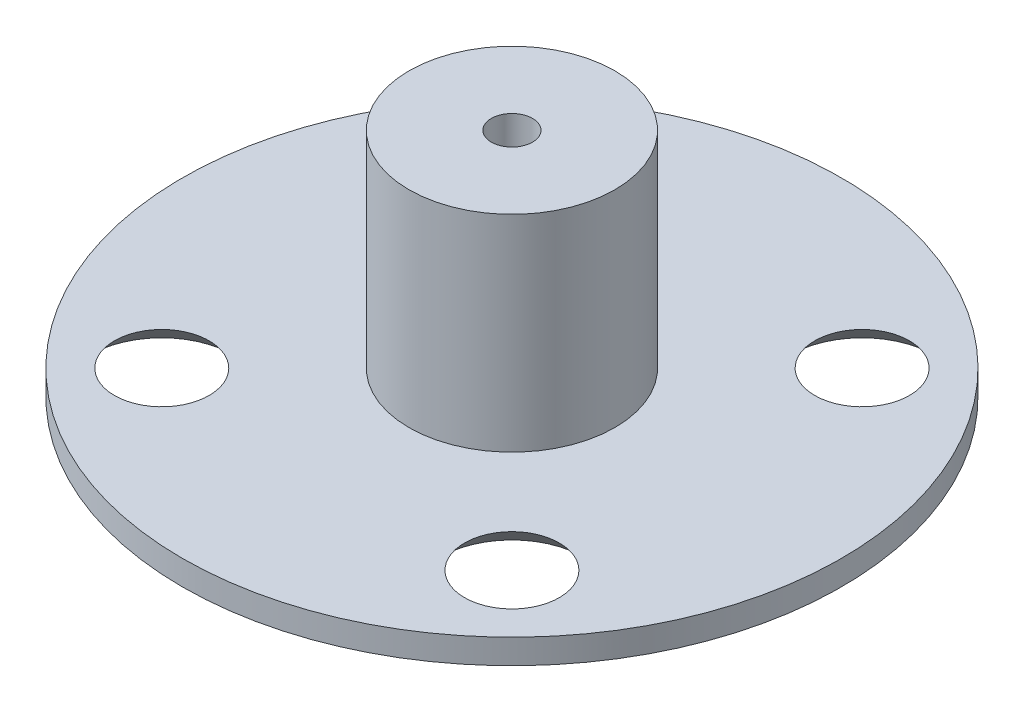
ISO-10303-21;
HEADER;
FILE_DESCRIPTION(('STEP AP214'),'2;1');
FILE_NAME('part.step','',(''),(''),'','','');
FILE_SCHEMA(('AUTOMOTIVE_DESIGN { 1 0 10303 214 1 1 1 1 }'));
ENDSEC;
DATA;
#1=APPLICATION_CONTEXT('core data for automotive mechanical design processes');
#2=APPLICATION_PROTOCOL_DEFINITION('international standard','automotive_design',2000,#1);
#3=PRODUCT_CONTEXT('',#1,'mechanical');
#4=PRODUCT('Part','Part','',(#3));
#5=PRODUCT_RELATED_PRODUCT_CATEGORY('part','',(#4));
#6=PRODUCT_DEFINITION_FORMATION('','',#4);
#7=PRODUCT_DEFINITION_CONTEXT('part definition',#1,'design');
#8=PRODUCT_DEFINITION('design','',#6,#7);
#9=PRODUCT_DEFINITION_SHAPE('','',#8);
#10=(LENGTH_UNIT() NAMED_UNIT(*) SI_UNIT(.MILLI.,.METRE.));
#11=(NAMED_UNIT(*) PLANE_ANGLE_UNIT() SI_UNIT($,.RADIAN.));
#12=(NAMED_UNIT(*) SI_UNIT($,.STERADIAN.) SOLID_ANGLE_UNIT());
#13=UNCERTAINTY_MEASURE_WITH_UNIT(LENGTH_MEASURE(1.E-05),#10,'distance_accuracy_value','');
#14=(GEOMETRIC_REPRESENTATION_CONTEXT(3) GLOBAL_UNCERTAINTY_ASSIGNED_CONTEXT((#13)) GLOBAL_UNIT_ASSIGNED_CONTEXT((#10,
#11,#12)) REPRESENTATION_CONTEXT('',''));
#15=CARTESIAN_POINT('',(0.,0.,0.));
#16=DIRECTION('',(0.,0.,1.));
#17=DIRECTION('',(1.,0.,0.));
#18=AXIS2_PLACEMENT_3D('',#15,#16,#17);
#19=CARTESIAN_POINT('',(0.,0.6,0.));
#20=DIRECTION('',(0.,1.,0.));
#21=DIRECTION('',(0.,0.,1.));
#22=AXIS2_PLACEMENT_3D('',#19,#20,#21);
#23=PLANE('',#22);
#24=CARTESIAN_POINT('',(4.25,0.6,4.25));
#25=DIRECTION('',(0.,1.,0.));
#26=DIRECTION('',(0.,0.,1.));
#27=AXIS2_PLACEMENT_3D('',#24,#25,#26);
#28=CIRCLE('',#27,1.15000000000001);
#29=CARTESIAN_POINT('',(4.25,0.6,5.40000000000001));
#30=VERTEX_POINT('',#29);
#31=EDGE_CURVE('E10',#30,#30,#28,.F.);
#32=ORIENTED_EDGE('',*,*,#31,.T.);
#33=EDGE_LOOP('',(#32));
#34=FACE_BOUND('',#33,.T.);
#35=CARTESIAN_POINT('',(-4.25,0.6,4.25));
#36=DIRECTION('',(0.,1.,0.));
#37=DIRECTION('',(0.,0.,1.));
#38=AXIS2_PLACEMENT_3D('',#35,#36,#37);
#39=CIRCLE('',#38,1.15000000000001);
#40=CARTESIAN_POINT('',(-4.25,0.6,5.40000000000001));
#41=VERTEX_POINT('',#40);
#42=EDGE_CURVE('E43',#41,#41,#39,.F.);
#43=ORIENTED_EDGE('',*,*,#42,.T.);
#44=EDGE_LOOP('',(#43));
#45=FACE_BOUND('',#44,.T.);
#46=CARTESIAN_POINT('',(-4.25,0.6,-4.25));
#47=DIRECTION('',(0.,1.,0.));
#48=DIRECTION('',(0.,0.,1.));
#49=AXIS2_PLACEMENT_3D('',#46,#47,#48);
#50=CIRCLE('',#49,1.15000000000001);
#51=CARTESIAN_POINT('',(-4.25,0.6,-3.09999999999999));
#52=VERTEX_POINT('',#51);
#53=EDGE_CURVE('E47',#52,#52,#50,.F.);
#54=ORIENTED_EDGE('',*,*,#53,.T.);
#55=EDGE_LOOP('',(#54));
#56=FACE_BOUND('',#55,.T.);
#57=CARTESIAN_POINT('',(4.25,0.6,-4.25));
#58=DIRECTION('',(0.,1.,0.));
#59=DIRECTION('',(0.,0.,1.));
#60=AXIS2_PLACEMENT_3D('',#57,#58,#59);
#61=CIRCLE('',#60,1.15000000000001);
#62=CARTESIAN_POINT('',(4.25,0.6,-3.09999999999999));
#63=VERTEX_POINT('',#62);
#64=EDGE_CURVE('E51',#63,#63,#61,.F.);
#65=ORIENTED_EDGE('',*,*,#64,.T.);
#66=EDGE_LOOP('',(#65));
#67=FACE_BOUND('',#66,.T.);
#68=CARTESIAN_POINT('',(0.,0.6,0.));
#69=DIRECTION('',(0.,1.,0.));
#70=DIRECTION('',(0.,0.,1.));
#71=AXIS2_PLACEMENT_3D('',#68,#69,#70);
#72=CIRCLE('',#71,2.5);
#73=CARTESIAN_POINT('',(0.,0.6,2.5));
#74=VERTEX_POINT('',#73);
#75=EDGE_CURVE('E75',#74,#74,#72,.T.);
#76=ORIENTED_EDGE('',*,*,#75,.F.);
#77=EDGE_LOOP('',(#76));
#78=FACE_BOUND('',#77,.T.);
#79=CARTESIAN_POINT('',(0.,0.6,0.));
#80=DIRECTION('',(0.,1.,0.));
#81=DIRECTION('',(0.,0.,1.));
#82=AXIS2_PLACEMENT_3D('',#79,#80,#81);
#83=CIRCLE('',#82,8.);
#84=CARTESIAN_POINT('',(0.,0.6,8.));
#85=VERTEX_POINT('',#84);
#86=EDGE_CURVE('E68',#85,#85,#83,.T.);
#87=ORIENTED_EDGE('',*,*,#86,.T.);
#88=EDGE_LOOP('',(#87));
#89=FACE_BOUND('',#88,.T.);
#90=ADVANCED_FACE('F35',(#34,#45,#56,#67,#78,#89),#23,.T.);
#91=CARTESIAN_POINT('',(0.,0.,0.));
#92=DIRECTION('',(0.,1.,0.));
#93=DIRECTION('',(0.,0.,1.));
#94=AXIS2_PLACEMENT_3D('',#91,#92,#93);
#95=PLANE('',#94);
#96=CARTESIAN_POINT('',(4.25,0.,4.25));
#97=DIRECTION('',(0.,1.,0.));
#98=DIRECTION('',(0.,0.,1.));
#99=AXIS2_PLACEMENT_3D('',#96,#97,#98);
#100=CIRCLE('',#99,1.75000000000001);
#101=CARTESIAN_POINT('',(4.25,0.,6.00000000000001));
#102=VERTEX_POINT('',#101);
#103=EDGE_CURVE('E56',#102,#102,#100,.T.);
#104=ORIENTED_EDGE('',*,*,#103,.T.);
#105=EDGE_LOOP('',(#104));
#106=FACE_BOUND('',#105,.T.);
#107=CARTESIAN_POINT('',(-4.25,0.,4.25));
#108=DIRECTION('',(0.,1.,0.));
#109=DIRECTION('',(0.,0.,1.));
#110=AXIS2_PLACEMENT_3D('',#107,#108,#109);
#111=CIRCLE('',#110,1.75000000000001);
#112=CARTESIAN_POINT('',(-4.25,0.,6.00000000000001));
#113=VERTEX_POINT('',#112);
#114=EDGE_CURVE('E59',#113,#113,#111,.T.);
#115=ORIENTED_EDGE('',*,*,#114,.T.);
#116=EDGE_LOOP('',(#115));
#117=FACE_BOUND('',#116,.T.);
#118=CARTESIAN_POINT('',(-4.25,0.,-4.25));
#119=DIRECTION('',(0.,1.,0.));
#120=DIRECTION('',(0.,0.,1.));
#121=AXIS2_PLACEMENT_3D('',#118,#119,#120);
#122=CIRCLE('',#121,1.75000000000001);
#123=CARTESIAN_POINT('',(-4.25,0.,-2.49999999999999));
#124=VERTEX_POINT('',#123);
#125=EDGE_CURVE('E62',#124,#124,#122,.T.);
#126=ORIENTED_EDGE('',*,*,#125,.T.);
#127=EDGE_LOOP('',(#126));
#128=FACE_BOUND('',#127,.T.);
#129=CARTESIAN_POINT('',(4.25,0.,-4.25));
#130=DIRECTION('',(0.,1.,0.));
#131=DIRECTION('',(0.,0.,1.));
#132=AXIS2_PLACEMENT_3D('',#129,#130,#131);
#133=CIRCLE('',#132,1.75000000000001);
#134=CARTESIAN_POINT('',(4.25,0.,-2.49999999999999));
#135=VERTEX_POINT('',#134);
#136=EDGE_CURVE('E65',#135,#135,#133,.T.);
#137=ORIENTED_EDGE('',*,*,#136,.T.);
#138=EDGE_LOOP('',(#137));
#139=FACE_BOUND('',#138,.T.);
#140=CARTESIAN_POINT('',(0.,0.,0.));
#141=DIRECTION('',(0.,1.,0.));
#142=DIRECTION('',(0.,0.,1.));
#143=AXIS2_PLACEMENT_3D('',#140,#141,#142);
#144=CIRCLE('',#143,0.5);
#145=CARTESIAN_POINT('',(0.,0.,0.500000000000001));
#146=VERTEX_POINT('',#145);
#147=EDGE_CURVE('E78',#146,#146,#144,.F.);
#148=ORIENTED_EDGE('',*,*,#147,.F.);
#149=EDGE_LOOP('',(#148));
#150=FACE_BOUND('',#149,.T.);
#151=CARTESIAN_POINT('',(0.,0.,0.));
#152=DIRECTION('',(0.,1.,0.));
#153=DIRECTION('',(0.,0.,1.));
#154=AXIS2_PLACEMENT_3D('',#151,#152,#153);
#155=CIRCLE('',#154,8.);
#156=CARTESIAN_POINT('',(0.,0.,8.));
#157=VERTEX_POINT('',#156);
#158=EDGE_CURVE('E69',#157,#157,#155,.T.);
#159=ORIENTED_EDGE('',*,*,#158,.F.);
#160=EDGE_LOOP('',(#159));
#161=FACE_BOUND('',#160,.T.);
#162=ADVANCED_FACE('F104',(#106,#117,#128,#139,#150,#161),#95,.F.);
#163=CARTESIAN_POINT('',(0.,0.6,0.));
#164=DIRECTION('',(0.,-1.,0.));
#165=DIRECTION('',(0.,0.,-1.));
#166=AXIS2_PLACEMENT_3D('',#163,#164,#165);
#167=CYLINDRICAL_SURFACE('',#166,8.);
#168=ORIENTED_EDGE('',*,*,#86,.F.);
#169=EDGE_LOOP('',(#168));
#170=FACE_BOUND('',#169,.T.);
#171=ORIENTED_EDGE('',*,*,#158,.T.);
#172=EDGE_LOOP('',(#171));
#173=FACE_BOUND('',#172,.T.);
#174=ADVANCED_FACE('F98',(#170,#173),#167,.T.);
#175=CARTESIAN_POINT('',(0.,5.6,0.));
#176=DIRECTION('',(0.,-1.,0.));
#177=DIRECTION('',(0.,0.,-1.));
#178=AXIS2_PLACEMENT_3D('',#175,#176,#177);
#179=CYLINDRICAL_SURFACE('',#178,2.5);
#180=CARTESIAN_POINT('',(0.,5.6,0.));
#181=DIRECTION('',(0.,1.,0.));
#182=DIRECTION('',(0.,0.,1.));
#183=AXIS2_PLACEMENT_3D('',#180,#181,#182);
#184=CIRCLE('',#183,2.5);
#185=CARTESIAN_POINT('',(0.,5.6,2.5));
#186=VERTEX_POINT('',#185);
#187=EDGE_CURVE('E72',#186,#186,#184,.T.);
#188=ORIENTED_EDGE('',*,*,#187,.F.);
#189=EDGE_LOOP('',(#188));
#190=FACE_BOUND('',#189,.T.);
#191=ORIENTED_EDGE('',*,*,#75,.T.);
#192=EDGE_LOOP('',(#191));
#193=FACE_BOUND('',#192,.T.);
#194=ADVANCED_FACE('F92',(#190,#193),#179,.T.);
#195=CARTESIAN_POINT('',(0.,5.6,0.));
#196=DIRECTION('',(0.,1.,0.));
#197=DIRECTION('',(0.,0.,1.));
#198=AXIS2_PLACEMENT_3D('',#195,#196,#197);
#199=PLANE('',#198);
#200=CARTESIAN_POINT('',(0.,5.6,0.));
#201=DIRECTION('',(0.,1.,0.));
#202=DIRECTION('',(0.,0.,1.));
#203=AXIS2_PLACEMENT_3D('',#200,#201,#202);
#204=CIRCLE('',#203,0.5);
#205=CARTESIAN_POINT('',(0.,5.6,0.500000000000001));
#206=VERTEX_POINT('',#205);
#207=EDGE_CURVE('E83',#206,#206,#204,.T.);
#208=ORIENTED_EDGE('',*,*,#207,.F.);
#209=EDGE_LOOP('',(#208));
#210=FACE_BOUND('',#209,.T.);
#211=ORIENTED_EDGE('',*,*,#187,.T.);
#212=EDGE_LOOP('',(#211));
#213=FACE_BOUND('',#212,.T.);
#214=ADVANCED_FACE('F89',(#210,#213),#199,.T.);
#215=CARTESIAN_POINT('',(0.,-1.4142135623731,0.));
#216=DIRECTION('',(0.,1.,0.));
#217=DIRECTION('',(0.,0.,1.));
#218=AXIS2_PLACEMENT_3D('',#215,#216,#217);
#219=CYLINDRICAL_SURFACE('',#218,0.5);
#220=ORIENTED_EDGE('',*,*,#147,.T.);
#221=EDGE_LOOP('',(#220));
#222=FACE_BOUND('',#221,.T.);
#223=ORIENTED_EDGE('',*,*,#207,.T.);
#224=EDGE_LOOP('',(#223));
#225=FACE_BOUND('',#224,.T.);
#226=ADVANCED_FACE('F87',(#222,#225),#219,.F.);
#227=CARTESIAN_POINT('',(4.25,0.,4.25));
#228=DIRECTION('',(0.,-1.,0.));
#229=DIRECTION('',(0.,0.,-1.));
#230=AXIS2_PLACEMENT_3D('',#227,#228,#229);
#231=CONICAL_SURFACE('',#230,1.75000000000001,0.785398163397453);
#232=ORIENTED_EDGE('',*,*,#31,.F.);
#233=EDGE_LOOP('',(#232));
#234=FACE_BOUND('',#233,.T.);
#235=ORIENTED_EDGE('',*,*,#103,.F.);
#236=EDGE_LOOP('',(#235));
#237=FACE_BOUND('',#236,.T.);
#238=ADVANCED_FACE('F121',(#234,#237),#231,.F.);
#239=CARTESIAN_POINT('',(-4.25,0.,4.25));
#240=DIRECTION('',(0.,-1.,0.));
#241=DIRECTION('',(0.,0.,-1.));
#242=AXIS2_PLACEMENT_3D('',#239,#240,#241);
#243=CONICAL_SURFACE('',#242,1.75000000000001,0.785398163397453);
#244=ORIENTED_EDGE('',*,*,#42,.F.);
#245=EDGE_LOOP('',(#244));
#246=FACE_BOUND('',#245,.T.);
#247=ORIENTED_EDGE('',*,*,#114,.F.);
#248=EDGE_LOOP('',(#247));
#249=FACE_BOUND('',#248,.T.);
#250=ADVANCED_FACE('F127',(#246,#249),#243,.F.);
#251=CARTESIAN_POINT('',(-4.25,0.,-4.25));
#252=DIRECTION('',(0.,-1.,0.));
#253=DIRECTION('',(0.,0.,-1.));
#254=AXIS2_PLACEMENT_3D('',#251,#252,#253);
#255=CONICAL_SURFACE('',#254,1.75000000000001,0.785398163397454);
#256=ORIENTED_EDGE('',*,*,#53,.F.);
#257=EDGE_LOOP('',(#256));
#258=FACE_BOUND('',#257,.T.);
#259=ORIENTED_EDGE('',*,*,#125,.F.);
#260=EDGE_LOOP('',(#259));
#261=FACE_BOUND('',#260,.T.);
#262=ADVANCED_FACE('F133',(#258,#261),#255,.F.);
#263=CARTESIAN_POINT('',(4.25,0.,-4.25));
#264=DIRECTION('',(0.,-1.,0.));
#265=DIRECTION('',(0.,0.,-1.));
#266=AXIS2_PLACEMENT_3D('',#263,#264,#265);
#267=CONICAL_SURFACE('',#266,1.75000000000001,0.785398163397453);
#268=ORIENTED_EDGE('',*,*,#64,.F.);
#269=EDGE_LOOP('',(#268));
#270=FACE_BOUND('',#269,.T.);
#271=ORIENTED_EDGE('',*,*,#136,.F.);
#272=EDGE_LOOP('',(#271));
#273=FACE_BOUND('',#272,.T.);
#274=ADVANCED_FACE('F38',(#270,#273),#267,.F.);
#275=CLOSED_SHELL('',(#90,#162,#174,#194,#214,#226,#238,#250,#262,#274));
#276=MANIFOLD_SOLID_BREP('B2',#275);
#277=ADVANCED_BREP_SHAPE_REPRESENTATION('',(#18,#276),#14);
#278=SHAPE_DEFINITION_REPRESENTATION(#9,#277);
ENDSEC;
END-ISO-10303-21;
